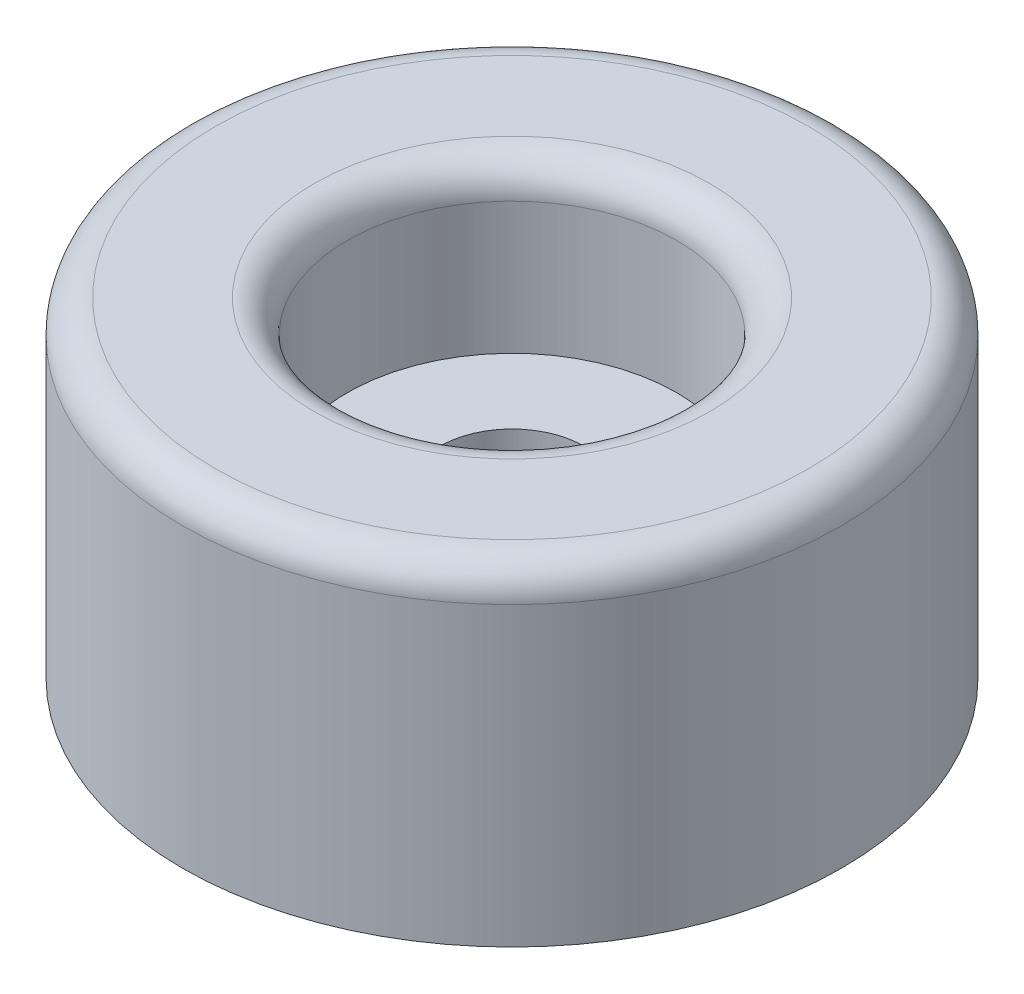
ISO-10303-21;
HEADER;
FILE_DESCRIPTION(('STEP AP214'),'2;1');
FILE_NAME('part.step','',(''),(''),'','','');
FILE_SCHEMA(('AUTOMOTIVE_DESIGN { 1 0 10303 214 1 1 1 1 }'));
ENDSEC;
DATA;
#1=APPLICATION_CONTEXT('core data for automotive mechanical design processes');
#2=APPLICATION_PROTOCOL_DEFINITION('international standard','automotive_design',2000,#1);
#3=PRODUCT_CONTEXT('',#1,'mechanical');
#4=PRODUCT('Part','Part','',(#3));
#5=PRODUCT_RELATED_PRODUCT_CATEGORY('part','',(#4));
#6=PRODUCT_DEFINITION_FORMATION('','',#4);
#7=PRODUCT_DEFINITION_CONTEXT('part definition',#1,'design');
#8=PRODUCT_DEFINITION('design','',#6,#7);
#9=PRODUCT_DEFINITION_SHAPE('','',#8);
#10=(LENGTH_UNIT() NAMED_UNIT(*) SI_UNIT(.MILLI.,.METRE.));
#11=(NAMED_UNIT(*) PLANE_ANGLE_UNIT() SI_UNIT($,.RADIAN.));
#12=(NAMED_UNIT(*) SI_UNIT($,.STERADIAN.) SOLID_ANGLE_UNIT());
#13=UNCERTAINTY_MEASURE_WITH_UNIT(LENGTH_MEASURE(1.E-05),#10,'distance_accuracy_value','');
#14=(GEOMETRIC_REPRESENTATION_CONTEXT(3) GLOBAL_UNCERTAINTY_ASSIGNED_CONTEXT((#13)) GLOBAL_UNIT_ASSIGNED_CONTEXT((#10,
#11,#12)) REPRESENTATION_CONTEXT('',''));
#15=CARTESIAN_POINT('',(0.,0.,0.));
#16=DIRECTION('',(0.,0.,1.));
#17=DIRECTION('',(1.,0.,0.));
#18=AXIS2_PLACEMENT_3D('',#15,#16,#17);
#19=CARTESIAN_POINT('',(0.,12.7,0.));
#20=DIRECTION('',(0.,-1.,0.));
#21=DIRECTION('',(0.,0.,-1.));
#22=AXIS2_PLACEMENT_3D('',#19,#20,#21);
#23=CYLINDRICAL_SURFACE('',#22,12.7);
#24=CARTESIAN_POINT('',(0.,11.43,0.));
#25=DIRECTION('',(0.,1.,0.));
#26=DIRECTION('',(0.,0.,1.));
#27=AXIS2_PLACEMENT_3D('',#24,#25,#26);
#28=CIRCLE('',#27,12.7);
#29=CARTESIAN_POINT('',(0.,11.43,12.7));
#30=VERTEX_POINT('',#29);
#31=EDGE_CURVE('E10',#30,#30,#28,.F.);
#32=ORIENTED_EDGE('',*,*,#31,.T.);
#33=EDGE_LOOP('',(#32));
#34=FACE_BOUND('',#33,.T.);
#35=CARTESIAN_POINT('',(0.,0.,0.));
#36=DIRECTION('',(0.,1.,0.));
#37=DIRECTION('',(0.,0.,1.));
#38=AXIS2_PLACEMENT_3D('',#35,#36,#37);
#39=CIRCLE('',#38,12.7);
#40=CARTESIAN_POINT('',(0.,0.,12.7));
#41=VERTEX_POINT('',#40);
#42=EDGE_CURVE('E61',#41,#41,#39,.T.);
#43=ORIENTED_EDGE('',*,*,#42,.T.);
#44=EDGE_LOOP('',(#43));
#45=FACE_BOUND('',#44,.T.);
#46=ADVANCED_FACE('F37',(#34,#45),#23,.T.);
#47=CARTESIAN_POINT('',(0.,12.7,0.));
#48=DIRECTION('',(0.,1.,0.));
#49=DIRECTION('',(0.,0.,1.));
#50=AXIS2_PLACEMENT_3D('',#47,#48,#49);
#51=PLANE('',#50);
#52=CARTESIAN_POINT('',(0.,12.7,0.));
#53=DIRECTION('',(0.,1.,0.));
#54=DIRECTION('',(0.,0.,1.));
#55=AXIS2_PLACEMENT_3D('',#52,#53,#54);
#56=CIRCLE('',#55,7.62);
#57=CARTESIAN_POINT('',(0.,12.7,7.62));
#58=VERTEX_POINT('',#57);
#59=EDGE_CURVE('E45',#58,#58,#56,.F.);
#60=ORIENTED_EDGE('',*,*,#59,.T.);
#61=EDGE_LOOP('',(#60));
#62=FACE_BOUND('',#61,.T.);
#63=CARTESIAN_POINT('',(0.,12.7,0.));
#64=DIRECTION('',(0.,1.,0.));
#65=DIRECTION('',(0.,0.,1.));
#66=AXIS2_PLACEMENT_3D('',#63,#64,#65);
#67=CIRCLE('',#66,11.43);
#68=CARTESIAN_POINT('',(0.,12.7,11.43));
#69=VERTEX_POINT('',#68);
#70=EDGE_CURVE('E50',#69,#69,#67,.T.);
#71=ORIENTED_EDGE('',*,*,#70,.T.);
#72=EDGE_LOOP('',(#71));
#73=FACE_BOUND('',#72,.T.);
#74=ADVANCED_FACE('F101',(#62,#73),#51,.T.);
#75=CARTESIAN_POINT('',(0.,0.,0.));
#76=DIRECTION('',(0.,1.,0.));
#77=DIRECTION('',(0.,0.,1.));
#78=AXIS2_PLACEMENT_3D('',#75,#76,#77);
#79=PLANE('',#78);
#80=CARTESIAN_POINT('',(0.,0.,0.));
#81=DIRECTION('',(0.,1.,0.));
#82=DIRECTION('',(0.,0.,1.));
#83=AXIS2_PLACEMENT_3D('',#80,#81,#82);
#84=CIRCLE('',#83,2.778125);
#85=CARTESIAN_POINT('',(0.,0.,2.778125));
#86=VERTEX_POINT('',#85);
#87=EDGE_CURVE('E69',#86,#86,#84,.T.);
#88=ORIENTED_EDGE('',*,*,#87,.T.);
#89=EDGE_LOOP('',(#88));
#90=FACE_BOUND('',#89,.T.);
#91=ORIENTED_EDGE('',*,*,#42,.F.);
#92=EDGE_LOOP('',(#91));
#93=FACE_BOUND('',#92,.T.);
#94=ADVANCED_FACE('F78',(#90,#93),#79,.F.);
#95=CARTESIAN_POINT('',(0.,6.35,0.));
#96=DIRECTION('',(0.,1.,0.));
#97=DIRECTION('',(0.,0.,1.));
#98=AXIS2_PLACEMENT_3D('',#95,#96,#97);
#99=CYLINDRICAL_SURFACE('',#98,6.35);
#100=CARTESIAN_POINT('',(0.,11.43,0.));
#101=DIRECTION('',(0.,1.,0.));
#102=DIRECTION('',(0.,0.,1.));
#103=AXIS2_PLACEMENT_3D('',#100,#101,#102);
#104=CIRCLE('',#103,6.35);
#105=CARTESIAN_POINT('',(0.,11.43,6.35));
#106=VERTEX_POINT('',#105);
#107=EDGE_CURVE('E55',#106,#106,#104,.T.);
#108=ORIENTED_EDGE('',*,*,#107,.T.);
#109=EDGE_LOOP('',(#108));
#110=FACE_BOUND('',#109,.T.);
#111=CARTESIAN_POINT('',(0.,6.35,0.));
#112=DIRECTION('',(0.,1.,0.));
#113=DIRECTION('',(0.,0.,1.));
#114=AXIS2_PLACEMENT_3D('',#111,#112,#113);
#115=CIRCLE('',#114,6.35);
#116=CARTESIAN_POINT('',(0.,6.35,6.35));
#117=VERTEX_POINT('',#116);
#118=EDGE_CURVE('E65',#117,#117,#115,.T.);
#119=ORIENTED_EDGE('',*,*,#118,.F.);
#120=EDGE_LOOP('',(#119));
#121=FACE_BOUND('',#120,.T.);
#122=ADVANCED_FACE('F91',(#110,#121),#99,.F.);
#123=CARTESIAN_POINT('',(0.,6.35,0.));
#124=DIRECTION('',(0.,1.,0.));
#125=DIRECTION('',(0.,0.,1.));
#126=AXIS2_PLACEMENT_3D('',#123,#124,#125);
#127=PLANE('',#126);
#128=CARTESIAN_POINT('',(0.,6.35,0.));
#129=DIRECTION('',(0.,1.,0.));
#130=DIRECTION('',(0.,0.,1.));
#131=AXIS2_PLACEMENT_3D('',#128,#129,#130);
#132=CIRCLE('',#131,2.778125);
#133=CARTESIAN_POINT('',(0.,6.35,2.778125));
#134=VERTEX_POINT('',#133);
#135=EDGE_CURVE('E70',#134,#134,#132,.T.);
#136=ORIENTED_EDGE('',*,*,#135,.F.);
#137=EDGE_LOOP('',(#136));
#138=FACE_BOUND('',#137,.T.);
#139=ORIENTED_EDGE('',*,*,#118,.T.);
#140=EDGE_LOOP('',(#139));
#141=FACE_BOUND('',#140,.T.);
#142=ADVANCED_FACE('F85',(#138,#141),#127,.T.);
#143=CARTESIAN_POINT('',(0.,0.,0.));
#144=DIRECTION('',(0.,1.,0.));
#145=DIRECTION('',(0.,0.,1.));
#146=AXIS2_PLACEMENT_3D('',#143,#144,#145);
#147=CYLINDRICAL_SURFACE('',#146,2.778125);
#148=ORIENTED_EDGE('',*,*,#87,.F.);
#149=EDGE_LOOP('',(#148));
#150=FACE_BOUND('',#149,.T.);
#151=ORIENTED_EDGE('',*,*,#135,.T.);
#152=EDGE_LOOP('',(#151));
#153=FACE_BOUND('',#152,.T.);
#154=ADVANCED_FACE('F81',(#150,#153),#147,.F.);
#155=CARTESIAN_POINT('',(0.,11.43,0.));
#156=DIRECTION('',(0.,1.,0.));
#157=DIRECTION('',(0.,0.,1.));
#158=AXIS2_PLACEMENT_3D('',#155,#156,#157);
#159=TOROIDAL_SURFACE('',#158,7.62,1.27);
#160=ORIENTED_EDGE('',*,*,#59,.F.);
#161=EDGE_LOOP('',(#160));
#162=FACE_BOUND('',#161,.T.);
#163=ORIENTED_EDGE('',*,*,#107,.F.);
#164=EDGE_LOOP('',(#163));
#165=FACE_BOUND('',#164,.T.);
#166=ADVANCED_FACE('F84',(#162,#165),#159,.T.);
#167=CARTESIAN_POINT('',(0.,11.43,0.));
#168=DIRECTION('',(0.,1.,0.));
#169=DIRECTION('',(0.,0.,1.));
#170=AXIS2_PLACEMENT_3D('',#167,#168,#169);
#171=TOROIDAL_SURFACE('',#170,11.43,1.27);
#172=ORIENTED_EDGE('',*,*,#31,.F.);
#173=EDGE_LOOP('',(#172));
#174=FACE_BOUND('',#173,.T.);
#175=ORIENTED_EDGE('',*,*,#70,.F.);
#176=EDGE_LOOP('',(#175));
#177=FACE_BOUND('',#176,.T.);
#178=ADVANCED_FACE('F39',(#174,#177),#171,.T.);
#179=CLOSED_SHELL('',(#46,#74,#94,#122,#142,#154,#166,#178));
#180=MANIFOLD_SOLID_BREP('B2',#179);
#181=ADVANCED_BREP_SHAPE_REPRESENTATION('',(#18,#180),#14);
#182=SHAPE_DEFINITION_REPRESENTATION(#9,#181);
ENDSEC;
END-ISO-10303-21;
